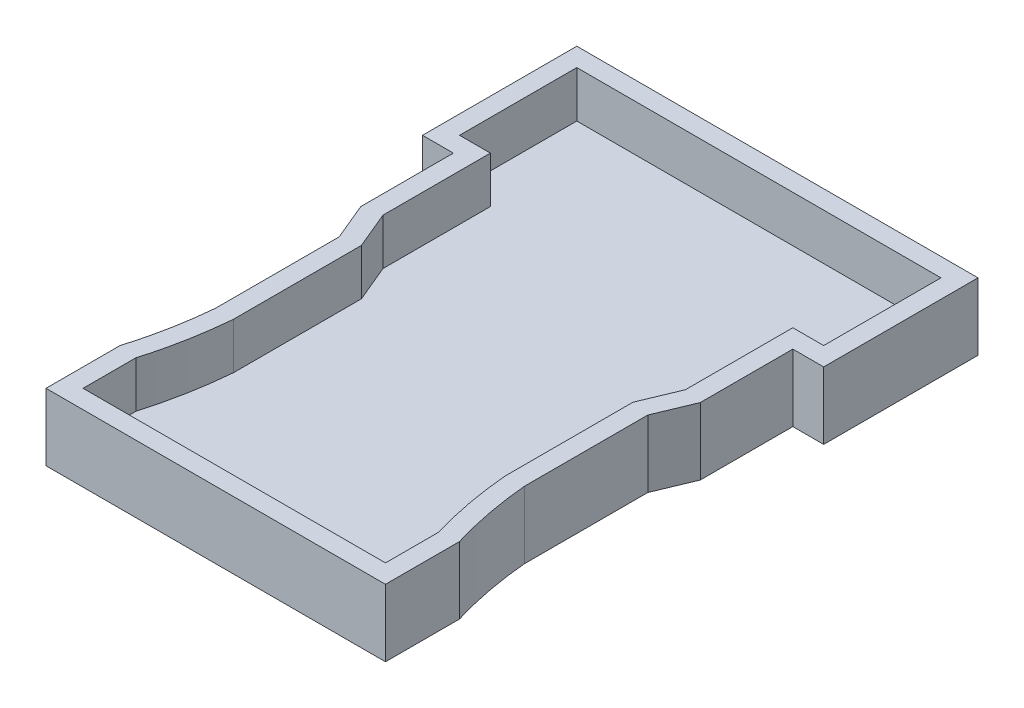
ISO-10303-21;
HEADER;
FILE_DESCRIPTION(('STEP AP214'),'2;1');
FILE_NAME('part.step','',(''),(''),'','','');
FILE_SCHEMA(('AUTOMOTIVE_DESIGN { 1 0 10303 214 1 1 1 1 }'));
ENDSEC;
DATA;
#1=APPLICATION_CONTEXT('core data for automotive mechanical design processes');
#2=APPLICATION_PROTOCOL_DEFINITION('international standard','automotive_design',2000,#1);
#3=PRODUCT_CONTEXT('',#1,'mechanical');
#4=PRODUCT('Part','Part','',(#3));
#5=PRODUCT_RELATED_PRODUCT_CATEGORY('part','',(#4));
#6=PRODUCT_DEFINITION_FORMATION('','',#4);
#7=PRODUCT_DEFINITION_CONTEXT('part definition',#1,'design');
#8=PRODUCT_DEFINITION('design','',#6,#7);
#9=PRODUCT_DEFINITION_SHAPE('','',#8);
#10=(LENGTH_UNIT() NAMED_UNIT(*) SI_UNIT(.MILLI.,.METRE.));
#11=(NAMED_UNIT(*) PLANE_ANGLE_UNIT() SI_UNIT($,.RADIAN.));
#12=(NAMED_UNIT(*) SI_UNIT($,.STERADIAN.) SOLID_ANGLE_UNIT());
#13=UNCERTAINTY_MEASURE_WITH_UNIT(LENGTH_MEASURE(1.E-05),#10,'distance_accuracy_value','');
#14=(GEOMETRIC_REPRESENTATION_CONTEXT(3) GLOBAL_UNCERTAINTY_ASSIGNED_CONTEXT((#13)) GLOBAL_UNIT_ASSIGNED_CONTEXT((#10,
#11,#12)) REPRESENTATION_CONTEXT('',''));
#15=CARTESIAN_POINT('',(0.,0.,0.));
#16=DIRECTION('',(0.,0.,1.));
#17=DIRECTION('',(1.,0.,0.));
#18=AXIS2_PLACEMENT_3D('',#15,#16,#17);
#19=CARTESIAN_POINT('',(97.3667090000003,18.415,69.4265820000001));
#20=CARTESIAN_POINT('',(98.3762706750737,18.415,80.7665378763553));
#21=CARTESIAN_POINT('',(101.599995682,18.415,91.4400000000001));
#22=B_SPLINE_CURVE_WITH_KNOTS('',2,(#19,#20,#21),.UNSPECIFIED.,.F.,.F.,(3,3),(0.,
0.50454040651961),.UNSPECIFIED.);
#23=DIRECTION('',(0.,-1.,0.));
#24=VECTOR('',#23,1.);
#25=SURFACE_OF_LINEAR_EXTRUSION('',#22,#24);
#26=CARTESIAN_POINT('',(97.3667090000003,0.,69.4265820000001));
#27=CARTESIAN_POINT('',(98.3762706750737,0.,80.7665378763553));
#28=CARTESIAN_POINT('',(101.599995682,0.,91.4400000000001));
#29=B_SPLINE_CURVE_WITH_KNOTS('',2,(#26,#27,#28),.UNSPECIFIED.,.F.,.F.,(3,3),(0.,
0.50454040651961),.UNSPECIFIED.);
#30=CARTESIAN_POINT('',(97.3667090000003,0.,69.4265820000001));
#31=VERTEX_POINT('',#30);
#32=CARTESIAN_POINT('',(101.599995682,0.,91.4400000000001));
#33=VERTEX_POINT('',#32);
#34=EDGE_CURVE('E211',#31,#33,#29,.T.);
#35=ORIENTED_EDGE('',*,*,#34,.F.);
#36=DIRECTION('',(0.,-1.,0.));
#37=VECTOR('',#36,1.);
#38=CARTESIAN_POINT('',(97.3667090000003,18.415,69.4265820000001));
#39=LINE('',#38,#37);
#40=CARTESIAN_POINT('',(97.3667090000003,18.415,69.4265820000001));
#41=VERTEX_POINT('',#40);
#42=EDGE_CURVE('E11',#41,#31,#39,.T.);
#43=ORIENTED_EDGE('',*,*,#42,.F.);
#44=CARTESIAN_POINT('',(101.599995682,18.415,91.4400000000001));
#45=VERTEX_POINT('',#44);
#46=EDGE_CURVE('E279',#41,#45,#22,.T.);
#47=ORIENTED_EDGE('',*,*,#46,.T.);
#48=DIRECTION('',(0.,-1.,0.));
#49=VECTOR('',#48,1.);
#50=CARTESIAN_POINT('',(101.599995682,18.415,91.4400000000001));
#51=LINE('',#50,#49);
#52=EDGE_CURVE('E76',#45,#33,#51,.T.);
#53=ORIENTED_EDGE('',*,*,#52,.T.);
#54=EDGE_LOOP('',(#35,#43,#47,#53));
#55=FACE_BOUND('',#54,.T.);
#56=ADVANCED_FACE('F47',(#55),#25,.T.);
#57=CARTESIAN_POINT('',(97.3667090000003,18.415,0.));
#58=DIRECTION('',(1.,0.,0.));
#59=DIRECTION('',(0.,0.,-1.));
#60=AXIS2_PLACEMENT_3D('',#57,#58,#59);
#61=PLANE('',#60);
#62=DIRECTION('',(0.,0.,1.));
#63=VECTOR('',#62,1.);
#64=CARTESIAN_POINT('',(97.3667090000003,0.,0.));
#65=LINE('',#64,#63);
#66=CARTESIAN_POINT('',(97.3667090000003,0.,35.5600000000001));
#67=VERTEX_POINT('',#66);
#68=EDGE_CURVE('E216',#67,#31,#65,.T.);
#69=ORIENTED_EDGE('',*,*,#68,.F.);
#70=DIRECTION('',(0.,-1.,0.));
#71=VECTOR('',#70,1.);
#72=CARTESIAN_POINT('',(97.3667090000003,18.415,35.5600000000001));
#73=LINE('',#72,#71);
#74=CARTESIAN_POINT('',(97.3667090000003,18.415,35.5600000000001));
#75=VERTEX_POINT('',#74);
#76=EDGE_CURVE('E59',#75,#67,#73,.T.);
#77=ORIENTED_EDGE('',*,*,#76,.F.);
#78=DIRECTION('',(0.,0.,1.));
#79=VECTOR('',#78,1.);
#80=CARTESIAN_POINT('',(97.3667090000003,18.415,0.));
#81=LINE('',#80,#79);
#82=EDGE_CURVE('E404',#75,#41,#81,.T.);
#83=ORIENTED_EDGE('',*,*,#82,.T.);
#84=ORIENTED_EDGE('',*,*,#42,.T.);
#85=EDGE_LOOP('',(#69,#77,#83,#84));
#86=FACE_BOUND('',#85,.T.);
#87=ADVANCED_FACE('F829',(#86),#61,.T.);
#88=CARTESIAN_POINT('',(95.5888279635049,18.415,39.8270851709958));
#89=DIRECTION('',(0.923082385009784,0.,0.38460227571434));
#90=DIRECTION('',(0.38460227571434,0.,-0.923082385009784));
#91=AXIS2_PLACEMENT_3D('',#88,#89,#90);
#92=PLANE('',#91);
#93=DIRECTION('',(-0.38460227571434,0.,0.923082385009784));
#94=VECTOR('',#93,1.);
#95=CARTESIAN_POINT('',(95.5888279635049,0.,39.8270851709958));
#96=LINE('',#95,#94);
#97=CARTESIAN_POINT('',(101.599873,0.,25.4000000000001));
#98=VERTEX_POINT('',#97);
#99=EDGE_CURVE('E224',#98,#67,#96,.T.);
#100=ORIENTED_EDGE('',*,*,#99,.F.);
#101=DIRECTION('',(0.,-1.,0.));
#102=VECTOR('',#101,1.);
#103=CARTESIAN_POINT('',(101.599873,18.415,25.4000000000001));
#104=LINE('',#103,#102);
#105=CARTESIAN_POINT('',(101.599873,18.415,25.4000000000001));
#106=VERTEX_POINT('',#105);
#107=EDGE_CURVE('E315',#106,#98,#104,.T.);
#108=ORIENTED_EDGE('',*,*,#107,.F.);
#109=DIRECTION('',(-0.38460227571434,0.,0.923082385009784));
#110=VECTOR('',#109,1.);
#111=CARTESIAN_POINT('',(95.5888279635049,18.415,39.8270851709958));
#112=LINE('',#111,#110);
#113=EDGE_CURVE('E400',#106,#75,#112,.T.);
#114=ORIENTED_EDGE('',*,*,#113,.T.);
#115=ORIENTED_EDGE('',*,*,#76,.T.);
#116=EDGE_LOOP('',(#100,#108,#114,#115));
#117=FACE_BOUND('',#116,.T.);
#118=ADVANCED_FACE('F833',(#117),#92,.T.);
#119=CARTESIAN_POINT('',(101.599873,18.415,0.));
#120=DIRECTION('',(1.,0.,0.));
#121=DIRECTION('',(0.,0.,-1.));
#122=AXIS2_PLACEMENT_3D('',#119,#120,#121);
#123=PLANE('',#122);
#124=DIRECTION('',(0.,0.,1.));
#125=VECTOR('',#124,1.);
#126=CARTESIAN_POINT('',(101.599873,0.,0.));
#127=LINE('',#126,#125);
#128=CARTESIAN_POINT('',(101.599873,0.,1.22987282083515E-13));
#129=VERTEX_POINT('',#128);
#130=EDGE_CURVE('E228',#129,#98,#127,.T.);
#131=ORIENTED_EDGE('',*,*,#130,.F.);
#132=DIRECTION('',(0.,-1.,0.));
#133=VECTOR('',#132,1.);
#134=CARTESIAN_POINT('',(101.599873,18.415,1.22987282083515E-13));
#135=LINE('',#134,#133);
#136=CARTESIAN_POINT('',(101.599873,18.415,1.22987282083515E-13));
#137=VERTEX_POINT('',#136);
#138=EDGE_CURVE('E312',#137,#129,#135,.T.);
#139=ORIENTED_EDGE('',*,*,#138,.F.);
#140=DIRECTION('',(0.,0.,1.));
#141=VECTOR('',#140,1.);
#142=CARTESIAN_POINT('',(101.599873,18.415,0.));
#143=LINE('',#142,#141);
#144=EDGE_CURVE('E396',#137,#106,#143,.T.);
#145=ORIENTED_EDGE('',*,*,#144,.T.);
#146=ORIENTED_EDGE('',*,*,#107,.T.);
#147=EDGE_LOOP('',(#131,#139,#145,#146));
#148=FACE_BOUND('',#147,.T.);
#149=ADVANCED_FACE('F843',(#148),#123,.T.);
#150=CARTESIAN_POINT('',(0.,18.415,1.35006249142304E-13));
#151=DIRECTION('',(0.,0.,1.));
#152=DIRECTION('',(1.,0.,0.));
#153=AXIS2_PLACEMENT_3D('',#150,#151,#152);
#154=PLANE('',#153);
#155=DIRECTION('',(-1.,0.,0.));
#156=VECTOR('',#155,1.);
#157=CARTESIAN_POINT('',(0.,0.,1.35006249142304E-13));
#158=LINE('',#157,#156);
#159=CARTESIAN_POINT('',(110.066582,0.,1.21985695235396E-13));
#160=VERTEX_POINT('',#159);
#161=EDGE_CURVE('E232',#160,#129,#158,.T.);
#162=ORIENTED_EDGE('',*,*,#161,.F.);
#163=DIRECTION('',(0.,-1.,0.));
#164=VECTOR('',#163,1.);
#165=CARTESIAN_POINT('',(110.066582,18.415,1.21985695235396E-13));
#166=LINE('',#165,#164);
#167=CARTESIAN_POINT('',(110.066582,18.415,1.21985695235396E-13));
#168=VERTEX_POINT('',#167);
#169=EDGE_CURVE('E309',#168,#160,#166,.T.);
#170=ORIENTED_EDGE('',*,*,#169,.F.);
#171=DIRECTION('',(-1.,0.,0.));
#172=VECTOR('',#171,1.);
#173=CARTESIAN_POINT('',(0.,18.415,1.35006249142304E-13));
#174=LINE('',#173,#172);
#175=EDGE_CURVE('E392',#168,#137,#174,.T.);
#176=ORIENTED_EDGE('',*,*,#175,.T.);
#177=ORIENTED_EDGE('',*,*,#138,.T.);
#178=EDGE_LOOP('',(#162,#170,#176,#177));
#179=FACE_BOUND('',#178,.T.);
#180=ADVANCED_FACE('F847',(#179),#154,.T.);
#181=CARTESIAN_POINT('',(110.066582,18.415,0.));
#182=DIRECTION('',(-1.,0.,0.));
#183=DIRECTION('',(0.,0.,1.));
#184=AXIS2_PLACEMENT_3D('',#181,#182,#183);
#185=PLANE('',#184);
#186=DIRECTION('',(0.,0.,-1.));
#187=VECTOR('',#186,1.);
#188=CARTESIAN_POINT('',(110.066582,0.,0.));
#189=LINE('',#188,#187);
#190=CARTESIAN_POINT('',(110.066582,0.,-42.333418));
#191=VERTEX_POINT('',#190);
#192=EDGE_CURVE('E236',#160,#191,#189,.T.);
#193=ORIENTED_EDGE('',*,*,#192,.T.);
#194=DIRECTION('',(0.,-1.,0.));
#195=VECTOR('',#194,1.);
#196=CARTESIAN_POINT('',(110.066582,18.415,-42.333418));
#197=LINE('',#196,#195);
#198=CARTESIAN_POINT('',(110.066582,18.415,-42.333418));
#199=VERTEX_POINT('',#198);
#200=EDGE_CURVE('E306',#199,#191,#197,.T.);
#201=ORIENTED_EDGE('',*,*,#200,.F.);
#202=DIRECTION('',(0.,0.,-1.));
#203=VECTOR('',#202,1.);
#204=CARTESIAN_POINT('',(110.066582,18.415,0.));
#205=LINE('',#204,#203);
#206=EDGE_CURVE('E389',#168,#199,#205,.T.);
#207=ORIENTED_EDGE('',*,*,#206,.F.);
#208=ORIENTED_EDGE('',*,*,#169,.T.);
#209=EDGE_LOOP('',(#193,#201,#207,#208));
#210=FACE_BOUND('',#209,.T.);
#211=ADVANCED_FACE('F852',(#210),#185,.F.);
#212=CARTESIAN_POINT('',(0.,18.415,-42.333418));
#213=DIRECTION('',(0.,0.,-1.));
#214=DIRECTION('',(-1.,0.,0.));
#215=AXIS2_PLACEMENT_3D('',#212,#213,#214);
#216=PLANE('',#215);
#217=DIRECTION('',(1.,0.,0.));
#218=VECTOR('',#217,1.);
#219=CARTESIAN_POINT('',(0.,0.,-42.333418));
#220=LINE('',#219,#218);
#221=CARTESIAN_POINT('',(0.,0.,-42.333418));
#222=VERTEX_POINT('',#221);
#223=EDGE_CURVE('E240',#222,#191,#220,.T.);
#224=ORIENTED_EDGE('',*,*,#223,.F.);
#225=DIRECTION('',(0.,-1.,0.));
#226=VECTOR('',#225,1.);
#227=CARTESIAN_POINT('',(0.,18.415,-42.333418));
#228=LINE('',#227,#226);
#229=CARTESIAN_POINT('',(0.,18.415,-42.333418));
#230=VERTEX_POINT('',#229);
#231=EDGE_CURVE('E303',#230,#222,#228,.T.);
#232=ORIENTED_EDGE('',*,*,#231,.F.);
#233=DIRECTION('',(1.,0.,0.));
#234=VECTOR('',#233,1.);
#235=CARTESIAN_POINT('',(0.,18.415,-42.333418));
#236=LINE('',#235,#234);
#237=EDGE_CURVE('E385',#230,#199,#236,.T.);
#238=ORIENTED_EDGE('',*,*,#237,.T.);
#239=ORIENTED_EDGE('',*,*,#200,.T.);
#240=EDGE_LOOP('',(#224,#232,#238,#239));
#241=FACE_BOUND('',#240,.T.);
#242=ADVANCED_FACE('F879',(#241),#216,.T.);
#243=CARTESIAN_POINT('',(0.,18.415,0.));
#244=DIRECTION('',(-1.,0.,0.));
#245=DIRECTION('',(0.,0.,1.));
#246=AXIS2_PLACEMENT_3D('',#243,#244,#245);
#247=PLANE('',#246);
#248=DIRECTION('',(0.,0.,-1.));
#249=VECTOR('',#248,1.);
#250=CARTESIAN_POINT('',(0.,0.,0.));
#251=LINE('',#250,#249);
#252=CARTESIAN_POINT('',(0.,0.,0.));
#253=VERTEX_POINT('',#252);
#254=EDGE_CURVE('E244',#253,#222,#251,.T.);
#255=ORIENTED_EDGE('',*,*,#254,.F.);
#256=DIRECTION('',(0.,-1.,0.));
#257=VECTOR('',#256,1.);
#258=CARTESIAN_POINT('',(0.,18.415,0.));
#259=LINE('',#258,#257);
#260=CARTESIAN_POINT('',(0.,18.415,0.));
#261=VERTEX_POINT('',#260);
#262=EDGE_CURVE('E300',#261,#253,#259,.T.);
#263=ORIENTED_EDGE('',*,*,#262,.F.);
#264=DIRECTION('',(0.,0.,-1.));
#265=VECTOR('',#264,1.);
#266=CARTESIAN_POINT('',(0.,18.415,0.));
#267=LINE('',#266,#265);
#268=EDGE_CURVE('E381',#261,#230,#267,.T.);
#269=ORIENTED_EDGE('',*,*,#268,.T.);
#270=ORIENTED_EDGE('',*,*,#231,.T.);
#271=EDGE_LOOP('',(#255,#263,#269,#270));
#272=FACE_BOUND('',#271,.T.);
#273=ADVANCED_FACE('F858',(#272),#247,.T.);
#274=CARTESIAN_POINT('',(0.,18.415,0.));
#275=DIRECTION('',(0.,0.,-1.));
#276=DIRECTION('',(-1.,0.,0.));
#277=AXIS2_PLACEMENT_3D('',#274,#275,#276);
#278=PLANE('',#277);
#279=DIRECTION('',(1.,0.,0.));
#280=VECTOR('',#279,1.);
#281=CARTESIAN_POINT('',(0.,0.,0.));
#282=LINE('',#281,#280);
#283=CARTESIAN_POINT('',(8.4666328,0.,0.));
#284=VERTEX_POINT('',#283);
#285=EDGE_CURVE('E248',#253,#284,#282,.T.);
#286=ORIENTED_EDGE('',*,*,#285,.T.);
#287=DIRECTION('',(0.,-1.,0.));
#288=VECTOR('',#287,1.);
#289=CARTESIAN_POINT('',(8.4666328,18.415,0.));
#290=LINE('',#289,#288);
#291=CARTESIAN_POINT('',(8.4666328,18.415,0.));
#292=VERTEX_POINT('',#291);
#293=EDGE_CURVE('E297',#292,#284,#290,.T.);
#294=ORIENTED_EDGE('',*,*,#293,.F.);
#295=DIRECTION('',(1.,0.,0.));
#296=VECTOR('',#295,1.);
#297=CARTESIAN_POINT('',(0.,18.415,0.));
#298=LINE('',#297,#296);
#299=EDGE_CURVE('E378',#261,#292,#298,.T.);
#300=ORIENTED_EDGE('',*,*,#299,.F.);
#301=ORIENTED_EDGE('',*,*,#262,.T.);
#302=EDGE_LOOP('',(#286,#294,#300,#301));
#303=FACE_BOUND('',#302,.T.);
#304=ADVANCED_FACE('F864',(#303),#278,.F.);
#305=CARTESIAN_POINT('',(8.4666328,18.415,0.));
#306=DIRECTION('',(-1.,0.,0.));
#307=DIRECTION('',(0.,0.,1.));
#308=AXIS2_PLACEMENT_3D('',#305,#306,#307);
#309=PLANE('',#308);
#310=DIRECTION('',(0.,0.,-1.));
#311=VECTOR('',#310,1.);
#312=CARTESIAN_POINT('',(8.4666328,0.,0.));
#313=LINE('',#312,#311);
#314=CARTESIAN_POINT('',(8.4666328,0.,25.4000000000001));
#315=VERTEX_POINT('',#314);
#316=EDGE_CURVE('E252',#315,#284,#313,.T.);
#317=ORIENTED_EDGE('',*,*,#316,.F.);
#318=DIRECTION('',(0.,-1.,0.));
#319=VECTOR('',#318,1.);
#320=CARTESIAN_POINT('',(8.4666328,18.415,25.4000000000001));
#321=LINE('',#320,#319);
#322=CARTESIAN_POINT('',(8.4666328,18.415,25.4000000000001));
#323=VERTEX_POINT('',#322);
#324=EDGE_CURVE('E294',#323,#315,#321,.T.);
#325=ORIENTED_EDGE('',*,*,#324,.F.);
#326=DIRECTION('',(0.,0.,-1.));
#327=VECTOR('',#326,1.);
#328=CARTESIAN_POINT('',(8.4666328,18.415,0.));
#329=LINE('',#328,#327);
#330=EDGE_CURVE('E374',#323,#292,#329,.T.);
#331=ORIENTED_EDGE('',*,*,#330,.T.);
#332=ORIENTED_EDGE('',*,*,#293,.T.);
#333=EDGE_LOOP('',(#317,#325,#331,#332));
#334=FACE_BOUND('',#333,.T.);
#335=ADVANCED_FACE('F870',(#334),#309,.T.);
#336=CARTESIAN_POINT('',(-1.80354521602617,18.415,0.751474167435595));
#337=DIRECTION('',(0.923077469275669,0.,-0.384614073735772));
#338=DIRECTION('',(-0.384614073735772,0.,-0.923077469275669));
#339=AXIS2_PLACEMENT_3D('',#336,#337,#338);
#340=PLANE('',#339);
#341=DIRECTION('',(0.384614073735772,0.,0.923077469275669));
#342=VECTOR('',#341,1.);
#343=CARTESIAN_POINT('',(-1.80354521602617,0.,0.751474167435595));
#344=LINE('',#343,#342);
#345=CARTESIAN_POINT('',(12.6999492000003,0.,35.5600000000001));
#346=VERTEX_POINT('',#345);
#347=EDGE_CURVE('E256',#315,#346,#344,.T.);
#348=ORIENTED_EDGE('',*,*,#347,.T.);
#349=DIRECTION('',(0.,-1.,0.));
#350=VECTOR('',#349,1.);
#351=CARTESIAN_POINT('',(12.6999492000003,18.415,35.5600000000001));
#352=LINE('',#351,#350);
#353=CARTESIAN_POINT('',(12.6999492000003,18.415,35.5600000000001));
#354=VERTEX_POINT('',#353);
#355=EDGE_CURVE('E290',#354,#346,#352,.T.);
#356=ORIENTED_EDGE('',*,*,#355,.F.);
#357=DIRECTION('',(0.384614073735772,0.,0.923077469275669));
#358=VECTOR('',#357,1.);
#359=CARTESIAN_POINT('',(-1.80354521602617,18.415,0.751474167435595));
#360=LINE('',#359,#358);
#361=EDGE_CURVE('E371',#323,#354,#360,.T.);
#362=ORIENTED_EDGE('',*,*,#361,.F.);
#363=ORIENTED_EDGE('',*,*,#324,.T.);
#364=EDGE_LOOP('',(#348,#356,#362,#363));
#365=FACE_BOUND('',#364,.T.);
#366=ADVANCED_FACE('F873',(#365),#340,.F.);
#367=CARTESIAN_POINT('',(12.6999492000003,18.415,0.));
#368=DIRECTION('',(1.,0.,0.));
#369=DIRECTION('',(0.,0.,-1.));
#370=AXIS2_PLACEMENT_3D('',#367,#368,#369);
#371=PLANE('',#370);
#372=DIRECTION('',(0.,0.,1.));
#373=VECTOR('',#372,1.);
#374=CARTESIAN_POINT('',(12.6999492000003,0.,0.));
#375=LINE('',#374,#373);
#376=CARTESIAN_POINT('',(12.6999492000003,0.,69.4265820000001));
#377=VERTEX_POINT('',#376);
#378=EDGE_CURVE('E259',#346,#377,#375,.T.);
#379=ORIENTED_EDGE('',*,*,#378,.T.);
#380=DIRECTION('',(0.,-1.,0.));
#381=VECTOR('',#380,1.);
#382=CARTESIAN_POINT('',(12.6999492000003,18.415,69.4265820000001));
#383=LINE('',#382,#381);
#384=CARTESIAN_POINT('',(12.6999492000003,18.415,69.4265820000001));
#385=VERTEX_POINT('',#384);
#386=EDGE_CURVE('E286',#385,#377,#383,.T.);
#387=ORIENTED_EDGE('',*,*,#386,.F.);
#388=DIRECTION('',(0.,0.,1.));
#389=VECTOR('',#388,1.);
#390=CARTESIAN_POINT('',(12.6999492000003,18.415,0.));
#391=LINE('',#390,#389);
#392=EDGE_CURVE('E365',#354,#385,#391,.T.);
#393=ORIENTED_EDGE('',*,*,#392,.F.);
#394=ORIENTED_EDGE('',*,*,#355,.T.);
#395=EDGE_LOOP('',(#379,#387,#393,#394));
#396=FACE_BOUND('',#395,.T.);
#397=ADVANCED_FACE('F357',(#396),#371,.F.);
#398=CARTESIAN_POINT('',(12.6999492000003,18.415,69.4265820000001));
#399=CARTESIAN_POINT('',(11.6904041894543,18.415,80.766544706064));
#400=CARTESIAN_POINT('',(8.46666328000029,18.415,91.4400000000001));
#401=B_SPLINE_CURVE_WITH_KNOTS('',2,(#398,#399,#400),.UNSPECIFIED.,.F.,.F.,(3,3),(0.,
0.504540068775169),.UNSPECIFIED.);
#402=DIRECTION('',(0.,-1.,0.));
#403=VECTOR('',#402,1.);
#404=SURFACE_OF_LINEAR_EXTRUSION('',#401,#403);
#405=CARTESIAN_POINT('',(12.6999492000003,0.,69.4265820000001));
#406=CARTESIAN_POINT('',(11.6904041894543,0.,80.766544706064));
#407=CARTESIAN_POINT('',(8.46666328000029,0.,91.4400000000001));
#408=B_SPLINE_CURVE_WITH_KNOTS('',2,(#405,#406,#407),.UNSPECIFIED.,.F.,.F.,(3,3),(0.,
0.504540068775169),.UNSPECIFIED.);
#409=CARTESIAN_POINT('',(8.46666328000029,0.,91.4400000000001));
#410=VERTEX_POINT('',#409);
#411=EDGE_CURVE('E262',#377,#410,#408,.T.);
#412=ORIENTED_EDGE('',*,*,#411,.T.);
#413=DIRECTION('',(0.,-1.,0.));
#414=VECTOR('',#413,1.);
#415=CARTESIAN_POINT('',(8.46666328000029,18.415,91.4400000000001));
#416=LINE('',#415,#414);
#417=CARTESIAN_POINT('',(8.46666328000029,18.415,91.4400000000001));
#418=VERTEX_POINT('',#417);
#419=EDGE_CURVE('E200',#418,#410,#416,.T.);
#420=ORIENTED_EDGE('',*,*,#419,.F.);
#421=EDGE_CURVE('E185',#385,#418,#401,.T.);
#422=ORIENTED_EDGE('',*,*,#421,.F.);
#423=ORIENTED_EDGE('',*,*,#386,.T.);
#424=EDGE_LOOP('',(#412,#420,#422,#423));
#425=FACE_BOUND('',#424,.T.);
#426=ADVANCED_FACE('F354',(#425),#404,.F.);
#427=CARTESIAN_POINT('',(8.46666328000028,18.415,0.));
#428=DIRECTION('',(1.,0.,0.));
#429=DIRECTION('',(0.,0.,-1.));
#430=AXIS2_PLACEMENT_3D('',#427,#428,#429);
#431=PLANE('',#430);
#432=DIRECTION('',(0.,0.,1.));
#433=VECTOR('',#432,1.);
#434=CARTESIAN_POINT('',(8.46666328000028,0.,0.));
#435=LINE('',#434,#433);
#436=CARTESIAN_POINT('',(8.46666328000029,0.,111.76));
#437=VERTEX_POINT('',#436);
#438=EDGE_CURVE('E195',#410,#437,#435,.T.);
#439=ORIENTED_EDGE('',*,*,#438,.T.);
#440=DIRECTION('',(0.,-1.,0.));
#441=VECTOR('',#440,1.);
#442=CARTESIAN_POINT('',(8.46666328000029,18.415,111.76));
#443=LINE('',#442,#441);
#444=CARTESIAN_POINT('',(8.46666328000029,18.415,111.76));
#445=VERTEX_POINT('',#444);
#446=EDGE_CURVE('E192',#445,#437,#443,.T.);
#447=ORIENTED_EDGE('',*,*,#446,.F.);
#448=DIRECTION('',(0.,0.,1.));
#449=VECTOR('',#448,1.);
#450=CARTESIAN_POINT('',(8.46666328000028,18.415,0.));
#451=LINE('',#450,#449);
#452=EDGE_CURVE('E178',#418,#445,#451,.T.);
#453=ORIENTED_EDGE('',*,*,#452,.F.);
#454=ORIENTED_EDGE('',*,*,#419,.T.);
#455=EDGE_LOOP('',(#439,#447,#453,#454));
#456=FACE_BOUND('',#455,.T.);
#457=ADVANCED_FACE('F193',(#456),#431,.F.);
#458=CARTESIAN_POINT('',(0.,18.415,111.76));
#459=DIRECTION('',(0.,0.,1.));
#460=DIRECTION('',(1.,0.,0.));
#461=AXIS2_PLACEMENT_3D('',#458,#459,#460);
#462=PLANE('',#461);
#463=DIRECTION('',(-1.,0.,0.));
#464=VECTOR('',#463,1.);
#465=CARTESIAN_POINT('',(0.,0.,111.76));
#466=LINE('',#465,#464);
#467=CARTESIAN_POINT('',(101.599995682,0.,111.76));
#468=VERTEX_POINT('',#467);
#469=EDGE_CURVE('E272',#468,#437,#466,.T.);
#470=ORIENTED_EDGE('',*,*,#469,.F.);
#471=DIRECTION('',(0.,-1.,0.));
#472=VECTOR('',#471,1.);
#473=CARTESIAN_POINT('',(101.599995682,18.415,111.76));
#474=LINE('',#473,#472);
#475=CARTESIAN_POINT('',(101.599995682,18.415,111.76));
#476=VERTEX_POINT('',#475);
#477=EDGE_CURVE('E201',#476,#468,#474,.T.);
#478=ORIENTED_EDGE('',*,*,#477,.F.);
#479=DIRECTION('',(-1.,0.,0.));
#480=VECTOR('',#479,1.);
#481=CARTESIAN_POINT('',(0.,18.415,111.76));
#482=LINE('',#481,#480);
#483=EDGE_CURVE('E183',#476,#445,#482,.T.);
#484=ORIENTED_EDGE('',*,*,#483,.T.);
#485=ORIENTED_EDGE('',*,*,#446,.T.);
#486=EDGE_LOOP('',(#470,#478,#484,#485));
#487=FACE_BOUND('',#486,.T.);
#488=ADVANCED_FACE('F203',(#487),#462,.T.);
#489=CARTESIAN_POINT('',(101.599995682,18.415,0.));
#490=DIRECTION('',(1.,0.,0.));
#491=DIRECTION('',(0.,0.,-1.));
#492=AXIS2_PLACEMENT_3D('',#489,#490,#491);
#493=PLANE('',#492);
#494=DIRECTION('',(0.,0.,1.));
#495=VECTOR('',#494,1.);
#496=CARTESIAN_POINT('',(101.599995682,0.,0.));
#497=LINE('',#496,#495);
#498=EDGE_CURVE('E275',#33,#468,#497,.T.);
#499=ORIENTED_EDGE('',*,*,#498,.F.);
#500=ORIENTED_EDGE('',*,*,#52,.F.);
#501=DIRECTION('',(0.,0.,1.));
#502=VECTOR('',#501,1.);
#503=CARTESIAN_POINT('',(101.599995682,18.415,0.));
#504=LINE('',#503,#502);
#505=EDGE_CURVE('E205',#45,#476,#504,.T.);
#506=ORIENTED_EDGE('',*,*,#505,.T.);
#507=ORIENTED_EDGE('',*,*,#477,.T.);
#508=EDGE_LOOP('',(#499,#500,#506,#507));
#509=FACE_BOUND('',#508,.T.);
#510=ADVANCED_FACE('F341',(#509),#493,.T.);
#511=CARTESIAN_POINT('',(0.,18.415,0.));
#512=DIRECTION('',(0.,1.,0.));
#513=DIRECTION('',(0.,0.,1.));
#514=AXIS2_PLACEMENT_3D('',#511,#512,#513);
#515=PLANE('',#514);
#516=DIRECTION('',(0.,0.,-1.));
#517=VECTOR('',#516,1.);
#518=CARTESIAN_POINT('',(104.986582,18.415,-5.07999999999988));
#519=LINE('',#518,#517);
#520=CARTESIAN_POINT('',(104.986582,18.415,-5.07999999999988));
#521=VERTEX_POINT('',#520);
#522=CARTESIAN_POINT('',(104.986582,18.415,-37.253418));
#523=VERTEX_POINT('',#522);
#524=EDGE_CURVE('E67',#521,#523,#519,.T.);
#525=ORIENTED_EDGE('',*,*,#524,.F.);
#526=DIRECTION('',(-1.,0.,0.));
#527=VECTOR('',#526,1.);
#528=CARTESIAN_POINT('',(104.986582,18.415,-5.07999999999988));
#529=LINE('',#528,#527);
#530=CARTESIAN_POINT('',(96.5198730000004,18.415,-5.07999999999988));
#531=VERTEX_POINT('',#530);
#532=EDGE_CURVE('E648',#521,#531,#529,.T.);
#533=ORIENTED_EDGE('',*,*,#532,.T.);
#534=DIRECTION('',(0.,0.,1.));
#535=VECTOR('',#534,1.);
#536=CARTESIAN_POINT('',(96.5198730000004,18.415,-5.07999999999988));
#537=LINE('',#536,#535);
#538=CARTESIAN_POINT('',(96.5198730000004,18.415,24.384037514015));
#539=VERTEX_POINT('',#538);
#540=EDGE_CURVE('E644',#531,#539,#537,.T.);
#541=ORIENTED_EDGE('',*,*,#540,.T.);
#542=DIRECTION('',(-0.38460227571434,0.,0.923082385009784));
#543=VECTOR('',#542,1.);
#544=CARTESIAN_POINT('',(96.5198730000004,18.415,24.384037514015));
#545=LINE('',#544,#543);
#546=CARTESIAN_POINT('',(92.2867090000003,18.415,34.5440375140149));
#547=VERTEX_POINT('',#546);
#548=EDGE_CURVE('E507',#539,#547,#545,.T.);
#549=ORIENTED_EDGE('',*,*,#548,.T.);
#550=DIRECTION('',(-5.53438970452129E-13,0.,1.));
#551=VECTOR('',#550,1.);
#552=CARTESIAN_POINT('',(92.2867090000003,18.415,34.5440375140149));
#553=LINE('',#552,#551);
#554=CARTESIAN_POINT('',(92.2867089999808,18.415,69.6498106312711));
#555=VERTEX_POINT('',#554);
#556=EDGE_CURVE('E498',#547,#555,#553,.T.);
#557=ORIENTED_EDGE('',*,*,#556,.T.);
#558=CARTESIAN_POINT('',(96.5199956819808,18.415,92.181575799748));
#559=CARTESIAN_POINT('',(94.3699508581627,18.415,84.8856837153887));
#560=CARTESIAN_POINT('',(92.959036165132,18.415,77.36838722479));
#561=CARTESIAN_POINT('',(92.2867089999967,18.415,69.6498106312798));
#562=B_SPLINE_CURVE_WITH_KNOTS('',3,(#558,#559,#560,#561),.UNSPECIFIED.,.F.,.F.,(4,4),(0.,1.),.UNSPECIFIED.);
#563=CARTESIAN_POINT('',(96.5199956819808,18.415,92.181575799748));
#564=VERTEX_POINT('',#563);
#565=EDGE_CURVE('E508',#555,#564,#562,.F.);
#566=ORIENTED_EDGE('',*,*,#565,.T.);
#567=DIRECTION('',(-7.11194278688606E-13,0.,1.));
#568=VECTOR('',#567,1.);
#569=CARTESIAN_POINT('',(96.5199956820106,18.415,92.1815757997671));
#570=LINE('',#569,#568);
#571=CARTESIAN_POINT('',(96.5199956820003,18.415,106.68));
#572=VERTEX_POINT('',#571);
#573=EDGE_CURVE('E511',#564,#572,#570,.T.);
#574=ORIENTED_EDGE('',*,*,#573,.T.);
#575=DIRECTION('',(-1.,0.,0.));
#576=VECTOR('',#575,1.);
#577=CARTESIAN_POINT('',(96.5199956820003,18.415,106.68));
#578=LINE('',#577,#576);
#579=CARTESIAN_POINT('',(13.5466632800003,18.415,106.68));
#580=VERTEX_POINT('',#579);
#581=EDGE_CURVE('E426',#572,#580,#578,.T.);
#582=ORIENTED_EDGE('',*,*,#581,.T.);
#583=DIRECTION('',(3.53204250310185E-13,0.,-1.));
#584=VECTOR('',#583,1.);
#585=CARTESIAN_POINT('',(13.5466632800003,18.415,106.68));
#586=LINE('',#585,#584);
#587=CARTESIAN_POINT('',(13.5466632800054,18.415,92.1815796197631));
#588=VERTEX_POINT('',#587);
#589=EDGE_CURVE('E423',#580,#588,#586,.T.);
#590=ORIENTED_EDGE('',*,*,#589,.T.);
#591=CARTESIAN_POINT('',(17.7799492000084,18.415,69.6498067943984));
#592=CARTESIAN_POINT('',(17.1076331661122,18.415,77.3683898631857));
#593=CARTESIAN_POINT('',(15.6967187581287,18.415,84.8856891977935));
#594=CARTESIAN_POINT('',(13.5466632800059,18.415,92.1815796197612));
#595=B_SPLINE_CURVE_WITH_KNOTS('',3,(#591,#592,#593,#594),.UNSPECIFIED.,.F.,.F.,(4,4),(0.,1.),.UNSPECIFIED.);
#596=CARTESIAN_POINT('',(17.7799492000084,18.415,69.6498067943984));
#597=VERTEX_POINT('',#596);
#598=EDGE_CURVE('E327',#588,#597,#595,.F.);
#599=ORIENTED_EDGE('',*,*,#598,.T.);
#600=DIRECTION('',(-1.15826771508622E-13,0.,-1.));
#601=VECTOR('',#600,1.);
#602=CARTESIAN_POINT('',(17.7799492000043,18.415,69.6498067943984));
#603=LINE('',#602,#601);
#604=CARTESIAN_POINT('',(17.7799492000003,18.415,34.5440037513864));
#605=VERTEX_POINT('',#604);
#606=EDGE_CURVE('E417',#597,#605,#603,.T.);
#607=ORIENTED_EDGE('',*,*,#606,.T.);
#608=DIRECTION('',(-0.384614073735772,0.,-0.923077469275669));
#609=VECTOR('',#608,1.);
#610=CARTESIAN_POINT('',(17.7799492000003,18.415,34.5440037513864));
#611=LINE('',#610,#609);
#612=CARTESIAN_POINT('',(13.5466328,18.415,24.3840037513864));
#613=VERTEX_POINT('',#612);
#614=EDGE_CURVE('E420',#605,#613,#611,.T.);
#615=ORIENTED_EDGE('',*,*,#614,.T.);
#616=DIRECTION('',(0.,0.,-1.));
#617=VECTOR('',#616,1.);
#618=CARTESIAN_POINT('',(13.5466328,18.415,24.3840037513864));
#619=LINE('',#618,#617);
#620=CARTESIAN_POINT('',(13.5466328,18.415,-5.08));
#621=VERTEX_POINT('',#620);
#622=EDGE_CURVE('E631',#613,#621,#619,.T.);
#623=ORIENTED_EDGE('',*,*,#622,.T.);
#624=DIRECTION('',(-1.,0.,0.));
#625=VECTOR('',#624,1.);
#626=CARTESIAN_POINT('',(13.5466328,18.415,-5.08));
#627=LINE('',#626,#625);
#628=CARTESIAN_POINT('',(5.08,18.415,-5.08));
#629=VERTEX_POINT('',#628);
#630=EDGE_CURVE('E627',#621,#629,#627,.T.);
#631=ORIENTED_EDGE('',*,*,#630,.T.);
#632=DIRECTION('',(0.,0.,-1.));
#633=VECTOR('',#632,1.);
#634=CARTESIAN_POINT('',(5.08,18.415,-5.08));
#635=LINE('',#634,#633);
#636=CARTESIAN_POINT('',(5.08,18.415,-37.253418));
#637=VERTEX_POINT('',#636);
#638=EDGE_CURVE('E623',#629,#637,#635,.T.);
#639=ORIENTED_EDGE('',*,*,#638,.T.);
#640=DIRECTION('',(1.,0.,0.));
#641=VECTOR('',#640,1.);
#642=CARTESIAN_POINT('',(5.08,18.415,-37.253418));
#643=LINE('',#642,#641);
#644=EDGE_CURVE('E619',#637,#523,#643,.T.);
#645=ORIENTED_EDGE('',*,*,#644,.T.);
#646=EDGE_LOOP('',(#525,#533,#541,#549,#557,#566,#574,#582,#590,#599,#607,#615,#623,#631,#639,#645));
#647=FACE_BOUND('',#646,.T.);
#648=ORIENTED_EDGE('',*,*,#46,.F.);
#649=ORIENTED_EDGE('',*,*,#82,.F.);
#650=ORIENTED_EDGE('',*,*,#113,.F.);
#651=ORIENTED_EDGE('',*,*,#144,.F.);
#652=ORIENTED_EDGE('',*,*,#175,.F.);
#653=ORIENTED_EDGE('',*,*,#206,.T.);
#654=ORIENTED_EDGE('',*,*,#237,.F.);
#655=ORIENTED_EDGE('',*,*,#268,.F.);
#656=ORIENTED_EDGE('',*,*,#299,.T.);
#657=ORIENTED_EDGE('',*,*,#330,.F.);
#658=ORIENTED_EDGE('',*,*,#361,.T.);
#659=ORIENTED_EDGE('',*,*,#392,.T.);
#660=ORIENTED_EDGE('',*,*,#421,.T.);
#661=ORIENTED_EDGE('',*,*,#452,.T.);
#662=ORIENTED_EDGE('',*,*,#483,.F.);
#663=ORIENTED_EDGE('',*,*,#505,.F.);
#664=EDGE_LOOP('',(#648,#649,#650,#651,#652,#653,#654,#655,#656,#657,#658,#659,#660,#661,#662,#663));
#665=FACE_BOUND('',#664,.T.);
#666=ADVANCED_FACE('F180',(#647,#665),#515,.T.);
#667=CARTESIAN_POINT('',(0.,0.,0.));
#668=DIRECTION('',(0.,1.,0.));
#669=DIRECTION('',(0.,0.,1.));
#670=AXIS2_PLACEMENT_3D('',#667,#668,#669);
#671=PLANE('',#670);
#672=ORIENTED_EDGE('',*,*,#34,.T.);
#673=ORIENTED_EDGE('',*,*,#498,.T.);
#674=ORIENTED_EDGE('',*,*,#469,.T.);
#675=ORIENTED_EDGE('',*,*,#438,.F.);
#676=ORIENTED_EDGE('',*,*,#411,.F.);
#677=ORIENTED_EDGE('',*,*,#378,.F.);
#678=ORIENTED_EDGE('',*,*,#347,.F.);
#679=ORIENTED_EDGE('',*,*,#316,.T.);
#680=ORIENTED_EDGE('',*,*,#285,.F.);
#681=ORIENTED_EDGE('',*,*,#254,.T.);
#682=ORIENTED_EDGE('',*,*,#223,.T.);
#683=ORIENTED_EDGE('',*,*,#192,.F.);
#684=ORIENTED_EDGE('',*,*,#161,.T.);
#685=ORIENTED_EDGE('',*,*,#130,.T.);
#686=ORIENTED_EDGE('',*,*,#99,.T.);
#687=ORIENTED_EDGE('',*,*,#68,.T.);
#688=EDGE_LOOP('',(#672,#673,#674,#675,#676,#677,#678,#679,#680,#681,#682,#683,#684,#685,#686,#687));
#689=FACE_BOUND('',#688,.T.);
#690=ADVANCED_FACE('F340',(#689),#671,.F.);
#691=CARTESIAN_POINT('',(104.986582,5.715,-5.07999999999988));
#692=DIRECTION('',(1.,0.,0.));
#693=DIRECTION('',(0.,0.,-1.));
#694=AXIS2_PLACEMENT_3D('',#691,#692,#693);
#695=PLANE('',#694);
#696=ORIENTED_EDGE('',*,*,#524,.T.);
#697=DIRECTION('',(0.,1.,0.));
#698=VECTOR('',#697,1.);
#699=CARTESIAN_POINT('',(104.986582,5.715,-37.253418));
#700=LINE('',#699,#698);
#701=CARTESIAN_POINT('',(104.986582,5.715,-37.253418));
#702=VERTEX_POINT('',#701);
#703=EDGE_CURVE('E614',#702,#523,#700,.T.);
#704=ORIENTED_EDGE('',*,*,#703,.F.);
#705=DIRECTION('',(0.,0.,-1.));
#706=VECTOR('',#705,1.);
#707=CARTESIAN_POINT('',(104.986582,5.715,-5.07999999999988));
#708=LINE('',#707,#706);
#709=CARTESIAN_POINT('',(104.986582,5.715,-5.07999999999988));
#710=VERTEX_POINT('',#709);
#711=EDGE_CURVE('E652',#710,#702,#708,.T.);
#712=ORIENTED_EDGE('',*,*,#711,.F.);
#713=DIRECTION('',(0.,1.,0.));
#714=VECTOR('',#713,1.);
#715=CARTESIAN_POINT('',(104.986582,5.715,-5.07999999999988));
#716=LINE('',#715,#714);
#717=EDGE_CURVE('E217',#710,#521,#716,.T.);
#718=ORIENTED_EDGE('',*,*,#717,.T.);
#719=EDGE_LOOP('',(#696,#704,#712,#718));
#720=FACE_BOUND('',#719,.T.);
#721=ADVANCED_FACE('F342',(#720),#695,.F.);
#722=CARTESIAN_POINT('',(104.986582,5.715,-5.07999999999988));
#723=DIRECTION('',(0.,0.,-1.));
#724=DIRECTION('',(-1.,0.,0.));
#725=AXIS2_PLACEMENT_3D('',#722,#723,#724);
#726=PLANE('',#725);
#727=ORIENTED_EDGE('',*,*,#532,.F.);
#728=ORIENTED_EDGE('',*,*,#717,.F.);
#729=DIRECTION('',(-1.,0.,0.));
#730=VECTOR('',#729,1.);
#731=CARTESIAN_POINT('',(104.986582,5.715,-5.07999999999988));
#732=LINE('',#731,#730);
#733=CARTESIAN_POINT('',(96.5198730000004,5.715,-5.07999999999988));
#734=VERTEX_POINT('',#733);
#735=EDGE_CURVE('E606',#710,#734,#732,.T.);
#736=ORIENTED_EDGE('',*,*,#735,.T.);
#737=DIRECTION('',(0.,1.,0.));
#738=VECTOR('',#737,1.);
#739=CARTESIAN_POINT('',(96.5198730000004,5.715,-5.07999999999988));
#740=LINE('',#739,#738);
#741=EDGE_CURVE('E655',#734,#531,#740,.T.);
#742=ORIENTED_EDGE('',*,*,#741,.T.);
#743=EDGE_LOOP('',(#727,#728,#736,#742));
#744=FACE_BOUND('',#743,.T.);
#745=ADVANCED_FACE('F539',(#744),#726,.T.);
#746=CARTESIAN_POINT('',(96.5198730000004,5.715,-5.07999999999988));
#747=DIRECTION('',(-1.,0.,0.));
#748=DIRECTION('',(0.,0.,1.));
#749=AXIS2_PLACEMENT_3D('',#746,#747,#748);
#750=PLANE('',#749);
#751=ORIENTED_EDGE('',*,*,#540,.F.);
#752=ORIENTED_EDGE('',*,*,#741,.F.);
#753=DIRECTION('',(0.,0.,1.));
#754=VECTOR('',#753,1.);
#755=CARTESIAN_POINT('',(96.5198730000004,5.715,-5.07999999999988));
#756=LINE('',#755,#754);
#757=CARTESIAN_POINT('',(96.5198730000004,5.715,24.384037514015));
#758=VERTEX_POINT('',#757);
#759=EDGE_CURVE('E598',#734,#758,#756,.T.);
#760=ORIENTED_EDGE('',*,*,#759,.T.);
#761=DIRECTION('',(0.,1.,0.));
#762=VECTOR('',#761,1.);
#763=CARTESIAN_POINT('',(96.5198730000004,5.715,24.384037514015));
#764=LINE('',#763,#762);
#765=EDGE_CURVE('E659',#758,#539,#764,.T.);
#766=ORIENTED_EDGE('',*,*,#765,.T.);
#767=EDGE_LOOP('',(#751,#752,#760,#766));
#768=FACE_BOUND('',#767,.T.);
#769=ADVANCED_FACE('F1014',(#768),#750,.T.);
#770=CARTESIAN_POINT('',(96.5198730000004,5.715,24.384037514015));
#771=DIRECTION('',(-0.923082385009784,0.,-0.38460227571434));
#772=DIRECTION('',(-0.38460227571434,0.,0.923082385009784));
#773=AXIS2_PLACEMENT_3D('',#770,#771,#772);
#774=PLANE('',#773);
#775=ORIENTED_EDGE('',*,*,#548,.F.);
#776=ORIENTED_EDGE('',*,*,#765,.F.);
#777=DIRECTION('',(-0.38460227571434,0.,0.923082385009784));
#778=VECTOR('',#777,1.);
#779=CARTESIAN_POINT('',(96.5198730000004,5.715,24.384037514015));
#780=LINE('',#779,#778);
#781=CARTESIAN_POINT('',(92.2867090000003,5.715,34.5440375140149));
#782=VERTEX_POINT('',#781);
#783=EDGE_CURVE('E470',#758,#782,#780,.T.);
#784=ORIENTED_EDGE('',*,*,#783,.T.);
#785=DIRECTION('',(0.,1.,0.));
#786=VECTOR('',#785,1.);
#787=CARTESIAN_POINT('',(92.2867090000003,5.715,34.5440375140149));
#788=LINE('',#787,#786);
#789=EDGE_CURVE('E590',#782,#547,#788,.T.);
#790=ORIENTED_EDGE('',*,*,#789,.T.);
#791=EDGE_LOOP('',(#775,#776,#784,#790));
#792=FACE_BOUND('',#791,.T.);
#793=ADVANCED_FACE('F1022',(#792),#774,.T.);
#794=CARTESIAN_POINT('',(92.2867090000003,5.715,34.5440375140149));
#795=DIRECTION('',(-1.,0.,-5.53438970452129E-13));
#796=DIRECTION('',(-5.53438970452129E-13,0.,1.));
#797=AXIS2_PLACEMENT_3D('',#794,#795,#796);
#798=PLANE('',#797);
#799=ORIENTED_EDGE('',*,*,#556,.F.);
#800=ORIENTED_EDGE('',*,*,#789,.F.);
#801=DIRECTION('',(-5.53438970452129E-13,0.,1.));
#802=VECTOR('',#801,1.);
#803=CARTESIAN_POINT('',(92.2867090000003,5.715,34.5440375140149));
#804=LINE('',#803,#802);
#805=CARTESIAN_POINT('',(92.2867089999808,5.715,69.6498106312711));
#806=VERTEX_POINT('',#805);
#807=EDGE_CURVE('E570',#782,#806,#804,.T.);
#808=ORIENTED_EDGE('',*,*,#807,.T.);
#809=DIRECTION('',(0.,1.,0.));
#810=VECTOR('',#809,1.);
#811=CARTESIAN_POINT('',(92.2867089999808,5.715,69.6498106312711));
#812=LINE('',#811,#810);
#813=EDGE_CURVE('E564',#806,#555,#812,.T.);
#814=ORIENTED_EDGE('',*,*,#813,.T.);
#815=EDGE_LOOP('',(#799,#800,#808,#814));
#816=FACE_BOUND('',#815,.T.);
#817=ADVANCED_FACE('F482',(#816),#798,.T.);
#818=CARTESIAN_POINT('',(92.2867089999967,5.715,69.6498106312798));
#819=CARTESIAN_POINT('',(92.959036165132,5.715,77.36838722479));
#820=CARTESIAN_POINT('',(94.3699508581627,5.715,84.8856837153887));
#821=CARTESIAN_POINT('',(96.5199956819808,5.715,92.181575799748));
#822=B_SPLINE_CURVE_WITH_KNOTS('',3,(#818,#819,#820,#821),.UNSPECIFIED.,.F.,.F.,(4,4),(0.,1.),.UNSPECIFIED.);
#823=DIRECTION('',(0.,1.,0.));
#824=VECTOR('',#823,1.);
#825=SURFACE_OF_LINEAR_EXTRUSION('',#822,#824);
#826=ORIENTED_EDGE('',*,*,#565,.F.);
#827=ORIENTED_EDGE('',*,*,#813,.F.);
#828=CARTESIAN_POINT('',(92.2867089999967,5.715,69.6498106312798));
#829=CARTESIAN_POINT('',(92.959036165132,5.715,77.36838722479));
#830=CARTESIAN_POINT('',(94.3699508581627,5.715,84.8856837153887));
#831=CARTESIAN_POINT('',(96.5199956819808,5.715,92.181575799748));
#832=B_SPLINE_CURVE_WITH_KNOTS('',3,(#828,#829,#830,#831),.UNSPECIFIED.,.F.,.F.,(4,4),(0.,1.),.UNSPECIFIED.);
#833=CARTESIAN_POINT('',(96.5199956819808,5.715,92.181575799748));
#834=VERTEX_POINT('',#833);
#835=EDGE_CURVE('E557',#806,#834,#832,.T.);
#836=ORIENTED_EDGE('',*,*,#835,.T.);
#837=DIRECTION('',(0.,1.,0.));
#838=VECTOR('',#837,1.);
#839=CARTESIAN_POINT('',(96.5199956819808,5.715,92.181575799748));
#840=LINE('',#839,#838);
#841=EDGE_CURVE('E560',#834,#564,#840,.T.);
#842=ORIENTED_EDGE('',*,*,#841,.T.);
#843=EDGE_LOOP('',(#826,#827,#836,#842));
#844=FACE_BOUND('',#843,.T.);
#845=ADVANCED_FACE('F476',(#844),#825,.T.);
#846=CARTESIAN_POINT('',(96.5199956820106,5.715,92.1815757997671));
#847=DIRECTION('',(-1.,0.,-7.11194278688606E-13));
#848=DIRECTION('',(-7.11194278688606E-13,0.,1.));
#849=AXIS2_PLACEMENT_3D('',#846,#847,#848);
#850=PLANE('',#849);
#851=ORIENTED_EDGE('',*,*,#573,.F.);
#852=ORIENTED_EDGE('',*,*,#841,.F.);
#853=DIRECTION('',(-7.11194278688606E-13,0.,1.));
#854=VECTOR('',#853,1.);
#855=CARTESIAN_POINT('',(96.5199956820106,5.715,92.1815757997671));
#856=LINE('',#855,#854);
#857=CARTESIAN_POINT('',(96.5199956820003,5.715,106.68));
#858=VERTEX_POINT('',#857);
#859=EDGE_CURVE('E464',#834,#858,#856,.T.);
#860=ORIENTED_EDGE('',*,*,#859,.T.);
#861=DIRECTION('',(0.,1.,0.));
#862=VECTOR('',#861,1.);
#863=CARTESIAN_POINT('',(96.5199956820003,5.715,106.68));
#864=LINE('',#863,#862);
#865=EDGE_CURVE('E576',#858,#572,#864,.T.);
#866=ORIENTED_EDGE('',*,*,#865,.T.);
#867=EDGE_LOOP('',(#851,#852,#860,#866));
#868=FACE_BOUND('',#867,.T.);
#869=ADVANCED_FACE('F481',(#868),#850,.T.);
#870=CARTESIAN_POINT('',(96.5199956820003,5.715,106.68));
#871=DIRECTION('',(0.,0.,-1.));
#872=DIRECTION('',(-1.,0.,0.));
#873=AXIS2_PLACEMENT_3D('',#870,#871,#872);
#874=PLANE('',#873);
#875=ORIENTED_EDGE('',*,*,#581,.F.);
#876=ORIENTED_EDGE('',*,*,#865,.F.);
#877=DIRECTION('',(-1.,0.,0.));
#878=VECTOR('',#877,1.);
#879=CARTESIAN_POINT('',(96.5199956820003,5.715,106.68));
#880=LINE('',#879,#878);
#881=CARTESIAN_POINT('',(13.5466632800003,5.715,106.68));
#882=VERTEX_POINT('',#881);
#883=EDGE_CURVE('E457',#858,#882,#880,.T.);
#884=ORIENTED_EDGE('',*,*,#883,.T.);
#885=DIRECTION('',(0.,1.,0.));
#886=VECTOR('',#885,1.);
#887=CARTESIAN_POINT('',(13.5466632800003,5.715,106.68));
#888=LINE('',#887,#886);
#889=EDGE_CURVE('E666',#882,#580,#888,.T.);
#890=ORIENTED_EDGE('',*,*,#889,.T.);
#891=EDGE_LOOP('',(#875,#876,#884,#890));
#892=FACE_BOUND('',#891,.T.);
#893=ADVANCED_FACE('F822',(#892),#874,.T.);
#894=CARTESIAN_POINT('',(13.5466632800003,5.715,106.68));
#895=DIRECTION('',(1.,0.,3.53204250310185E-13));
#896=DIRECTION('',(3.53204250310185E-13,0.,-1.));
#897=AXIS2_PLACEMENT_3D('',#894,#895,#896);
#898=PLANE('',#897);
#899=ORIENTED_EDGE('',*,*,#589,.F.);
#900=ORIENTED_EDGE('',*,*,#889,.F.);
#901=DIRECTION('',(3.53204250310185E-13,0.,-1.));
#902=VECTOR('',#901,1.);
#903=CARTESIAN_POINT('',(13.5466632800003,5.715,106.68));
#904=LINE('',#903,#902);
#905=CARTESIAN_POINT('',(13.5466632800054,5.715,92.1815796197631));
#906=VERTEX_POINT('',#905);
#907=EDGE_CURVE('E465',#882,#906,#904,.T.);
#908=ORIENTED_EDGE('',*,*,#907,.T.);
#909=DIRECTION('',(0.,1.,0.));
#910=VECTOR('',#909,1.);
#911=CARTESIAN_POINT('',(13.5466632800054,5.715,92.1815796197631));
#912=LINE('',#911,#910);
#913=EDGE_CURVE('E670',#906,#588,#912,.T.);
#914=ORIENTED_EDGE('',*,*,#913,.T.);
#915=EDGE_LOOP('',(#899,#900,#908,#914));
#916=FACE_BOUND('',#915,.T.);
#917=ADVANCED_FACE('F444',(#916),#898,.T.);
#918=CARTESIAN_POINT('',(13.5466632800059,5.715,92.1815796197612));
#919=CARTESIAN_POINT('',(15.6967187581287,5.715,84.8856891977935));
#920=CARTESIAN_POINT('',(17.1076331661122,5.715,77.3683898631857));
#921=CARTESIAN_POINT('',(17.7799492000084,5.715,69.6498067943984));
#922=B_SPLINE_CURVE_WITH_KNOTS('',3,(#918,#919,#920,#921),.UNSPECIFIED.,.F.,.F.,(4,4),(0.,1.),.UNSPECIFIED.);
#923=DIRECTION('',(0.,1.,0.));
#924=VECTOR('',#923,1.);
#925=SURFACE_OF_LINEAR_EXTRUSION('',#922,#924);
#926=ORIENTED_EDGE('',*,*,#598,.F.);
#927=ORIENTED_EDGE('',*,*,#913,.F.);
#928=CARTESIAN_POINT('',(13.5466632800059,5.715,92.1815796197612));
#929=CARTESIAN_POINT('',(15.6967187581287,5.715,84.8856891977935));
#930=CARTESIAN_POINT('',(17.1076331661122,5.715,77.3683898631857));
#931=CARTESIAN_POINT('',(17.7799492000084,5.715,69.6498067943984));
#932=B_SPLINE_CURVE_WITH_KNOTS('',3,(#928,#929,#930,#931),.UNSPECIFIED.,.F.,.F.,(4,4),(0.,1.),.UNSPECIFIED.);
#933=CARTESIAN_POINT('',(17.7799492000084,5.715,69.6498067943984));
#934=VERTEX_POINT('',#933);
#935=EDGE_CURVE('E524',#906,#934,#932,.T.);
#936=ORIENTED_EDGE('',*,*,#935,.T.);
#937=DIRECTION('',(0.,1.,0.));
#938=VECTOR('',#937,1.);
#939=CARTESIAN_POINT('',(17.7799492000084,5.715,69.6498067943984));
#940=LINE('',#939,#938);
#941=EDGE_CURVE('E675',#934,#597,#940,.T.);
#942=ORIENTED_EDGE('',*,*,#941,.T.);
#943=EDGE_LOOP('',(#926,#927,#936,#942));
#944=FACE_BOUND('',#943,.T.);
#945=ADVANCED_FACE('F432',(#944),#925,.T.);
#946=CARTESIAN_POINT('',(17.7799492000043,5.715,69.6498067943984));
#947=DIRECTION('',(1.,0.,-1.15826771508622E-13));
#948=DIRECTION('',(-1.15826771508622E-13,0.,-1.));
#949=AXIS2_PLACEMENT_3D('',#946,#947,#948);
#950=PLANE('',#949);
#951=ORIENTED_EDGE('',*,*,#606,.F.);
#952=ORIENTED_EDGE('',*,*,#941,.F.);
#953=DIRECTION('',(-1.15826771508622E-13,0.,-1.));
#954=VECTOR('',#953,1.);
#955=CARTESIAN_POINT('',(17.7799492000043,5.715,69.6498067943984));
#956=LINE('',#955,#954);
#957=CARTESIAN_POINT('',(17.7799492000003,5.715,34.5440037513864));
#958=VERTEX_POINT('',#957);
#959=EDGE_CURVE('E785',#934,#958,#956,.T.);
#960=ORIENTED_EDGE('',*,*,#959,.T.);
#961=DIRECTION('',(0.,1.,0.));
#962=VECTOR('',#961,1.);
#963=CARTESIAN_POINT('',(17.7799492000003,5.715,34.5440037513864));
#964=LINE('',#963,#962);
#965=EDGE_CURVE('E671',#958,#605,#964,.T.);
#966=ORIENTED_EDGE('',*,*,#965,.T.);
#967=EDGE_LOOP('',(#951,#952,#960,#966));
#968=FACE_BOUND('',#967,.T.);
#969=ADVANCED_FACE('F443',(#968),#950,.T.);
#970=CARTESIAN_POINT('',(17.7799492000003,5.715,34.5440037513864));
#971=DIRECTION('',(0.923077469275669,0.,-0.384614073735772));
#972=DIRECTION('',(-0.384614073735772,0.,-0.923077469275669));
#973=AXIS2_PLACEMENT_3D('',#970,#971,#972);
#974=PLANE('',#973);
#975=ORIENTED_EDGE('',*,*,#614,.F.);
#976=ORIENTED_EDGE('',*,*,#965,.F.);
#977=DIRECTION('',(-0.384614073735772,0.,-0.923077469275669));
#978=VECTOR('',#977,1.);
#979=CARTESIAN_POINT('',(17.7799492000003,5.715,34.5440037513864));
#980=LINE('',#979,#978);
#981=CARTESIAN_POINT('',(13.5466328,5.715,24.3840037513864));
#982=VERTEX_POINT('',#981);
#983=EDGE_CURVE('E455',#958,#982,#980,.T.);
#984=ORIENTED_EDGE('',*,*,#983,.T.);
#985=DIRECTION('',(0.,1.,0.));
#986=VECTOR('',#985,1.);
#987=CARTESIAN_POINT('',(13.5466328,5.715,24.3840037513864));
#988=LINE('',#987,#986);
#989=EDGE_CURVE('E676',#982,#613,#988,.T.);
#990=ORIENTED_EDGE('',*,*,#989,.T.);
#991=EDGE_LOOP('',(#975,#976,#984,#990));
#992=FACE_BOUND('',#991,.T.);
#993=ADVANCED_FACE('F1072',(#992),#974,.T.);
#994=CARTESIAN_POINT('',(13.5466328,5.715,24.3840037513864));
#995=DIRECTION('',(1.,0.,0.));
#996=DIRECTION('',(0.,0.,-1.));
#997=AXIS2_PLACEMENT_3D('',#994,#995,#996);
#998=PLANE('',#997);
#999=ORIENTED_EDGE('',*,*,#622,.F.);
#1000=ORIENTED_EDGE('',*,*,#989,.F.);
#1001=DIRECTION('',(0.,0.,-1.));
#1002=VECTOR('',#1001,1.);
#1003=CARTESIAN_POINT('',(13.5466328,5.715,24.3840037513864));
#1004=LINE('',#1003,#1002);
#1005=CARTESIAN_POINT('',(13.5466328,5.715,-5.08));
#1006=VERTEX_POINT('',#1005);
#1007=EDGE_CURVE('E778',#982,#1006,#1004,.T.);
#1008=ORIENTED_EDGE('',*,*,#1007,.T.);
#1009=DIRECTION('',(0.,1.,0.));
#1010=VECTOR('',#1009,1.);
#1011=CARTESIAN_POINT('',(13.5466328,5.715,-5.08));
#1012=LINE('',#1011,#1010);
#1013=EDGE_CURVE('E680',#1006,#621,#1012,.T.);
#1014=ORIENTED_EDGE('',*,*,#1013,.T.);
#1015=EDGE_LOOP('',(#999,#1000,#1008,#1014));
#1016=FACE_BOUND('',#1015,.T.);
#1017=ADVANCED_FACE('F1080',(#1016),#998,.T.);
#1018=CARTESIAN_POINT('',(13.5466328,5.715,-5.08));
#1019=DIRECTION('',(0.,0.,-1.));
#1020=DIRECTION('',(-1.,0.,0.));
#1021=AXIS2_PLACEMENT_3D('',#1018,#1019,#1020);
#1022=PLANE('',#1021);
#1023=ORIENTED_EDGE('',*,*,#630,.F.);
#1024=ORIENTED_EDGE('',*,*,#1013,.F.);
#1025=DIRECTION('',(-1.,0.,0.));
#1026=VECTOR('',#1025,1.);
#1027=CARTESIAN_POINT('',(13.5466328,5.715,-5.08));
#1028=LINE('',#1027,#1026);
#1029=CARTESIAN_POINT('',(5.08,5.715,-5.08));
#1030=VERTEX_POINT('',#1029);
#1031=EDGE_CURVE('E776',#1006,#1030,#1028,.T.);
#1032=ORIENTED_EDGE('',*,*,#1031,.T.);
#1033=DIRECTION('',(0.,1.,0.));
#1034=VECTOR('',#1033,1.);
#1035=CARTESIAN_POINT('',(5.08,5.715,-5.08));
#1036=LINE('',#1035,#1034);
#1037=EDGE_CURVE('E684',#1030,#629,#1036,.T.);
#1038=ORIENTED_EDGE('',*,*,#1037,.T.);
#1039=EDGE_LOOP('',(#1023,#1024,#1032,#1038));
#1040=FACE_BOUND('',#1039,.T.);
#1041=ADVANCED_FACE('F1088',(#1040),#1022,.T.);
#1042=CARTESIAN_POINT('',(5.08,5.715,-5.08));
#1043=DIRECTION('',(1.,0.,0.));
#1044=DIRECTION('',(0.,0.,-1.));
#1045=AXIS2_PLACEMENT_3D('',#1042,#1043,#1044);
#1046=PLANE('',#1045);
#1047=ORIENTED_EDGE('',*,*,#638,.F.);
#1048=ORIENTED_EDGE('',*,*,#1037,.F.);
#1049=DIRECTION('',(0.,0.,-1.));
#1050=VECTOR('',#1049,1.);
#1051=CARTESIAN_POINT('',(5.08,5.715,-5.08));
#1052=LINE('',#1051,#1050);
#1053=CARTESIAN_POINT('',(5.08,5.715,-37.253418));
#1054=VERTEX_POINT('',#1053);
#1055=EDGE_CURVE('E771',#1030,#1054,#1052,.T.);
#1056=ORIENTED_EDGE('',*,*,#1055,.T.);
#1057=DIRECTION('',(0.,1.,0.));
#1058=VECTOR('',#1057,1.);
#1059=CARTESIAN_POINT('',(5.08,5.715,-37.253418));
#1060=LINE('',#1059,#1058);
#1061=EDGE_CURVE('E688',#1054,#637,#1060,.T.);
#1062=ORIENTED_EDGE('',*,*,#1061,.T.);
#1063=EDGE_LOOP('',(#1047,#1048,#1056,#1062));
#1064=FACE_BOUND('',#1063,.T.);
#1065=ADVANCED_FACE('F707',(#1064),#1046,.T.);
#1066=CARTESIAN_POINT('',(5.08,5.715,-37.253418));
#1067=DIRECTION('',(0.,0.,1.));
#1068=DIRECTION('',(1.,0.,0.));
#1069=AXIS2_PLACEMENT_3D('',#1066,#1067,#1068);
#1070=PLANE('',#1069);
#1071=ORIENTED_EDGE('',*,*,#644,.F.);
#1072=ORIENTED_EDGE('',*,*,#1061,.F.);
#1073=DIRECTION('',(1.,0.,0.));
#1074=VECTOR('',#1073,1.);
#1075=CARTESIAN_POINT('',(5.08,5.715,-37.253418));
#1076=LINE('',#1075,#1074);
#1077=EDGE_CURVE('E699',#1054,#702,#1076,.T.);
#1078=ORIENTED_EDGE('',*,*,#1077,.T.);
#1079=ORIENTED_EDGE('',*,*,#703,.T.);
#1080=EDGE_LOOP('',(#1071,#1072,#1078,#1079));
#1081=FACE_BOUND('',#1080,.T.);
#1082=ADVANCED_FACE('F538',(#1081),#1070,.T.);
#1083=CARTESIAN_POINT('',(16.2174585315921,5.715,81.0742029496372));
#1084=DIRECTION('',(0.,-1.,0.));
#1085=DIRECTION('',(0.,0.,-1.));
#1086=AXIS2_PLACEMENT_3D('',#1083,#1084,#1085);
#1087=PLANE('',#1086);
#1088=ORIENTED_EDGE('',*,*,#711,.T.);
#1089=ORIENTED_EDGE('',*,*,#1077,.F.);
#1090=ORIENTED_EDGE('',*,*,#1055,.F.);
#1091=ORIENTED_EDGE('',*,*,#1031,.F.);
#1092=ORIENTED_EDGE('',*,*,#1007,.F.);
#1093=ORIENTED_EDGE('',*,*,#983,.F.);
#1094=ORIENTED_EDGE('',*,*,#959,.F.);
#1095=ORIENTED_EDGE('',*,*,#935,.F.);
#1096=ORIENTED_EDGE('',*,*,#907,.F.);
#1097=ORIENTED_EDGE('',*,*,#883,.F.);
#1098=ORIENTED_EDGE('',*,*,#859,.F.);
#1099=ORIENTED_EDGE('',*,*,#835,.F.);
#1100=ORIENTED_EDGE('',*,*,#807,.F.);
#1101=ORIENTED_EDGE('',*,*,#783,.F.);
#1102=ORIENTED_EDGE('',*,*,#759,.F.);
#1103=ORIENTED_EDGE('',*,*,#735,.F.);
#1104=EDGE_LOOP('',(#1088,#1089,#1090,#1091,#1092,#1093,#1094,#1095,#1096,#1097,#1098,#1099,
#1100,#1101,#1102,#1103));
#1105=FACE_BOUND('',#1104,.T.);
#1106=ADVANCED_FACE('F529',(#1105),#1087,.F.);
#1107=CLOSED_SHELL('',(#56,#87,#118,#149,#180,#211,#242,#273,#304,#335,#366,#397,#426,#457,#488,
#510,#666,#690,#721,#745,#769,#793,#817,#845,#869,#893,#917,#945,#969,#993,#1017,#1041,#1065,
#1082,#1106));
#1108=MANIFOLD_SOLID_BREP('B2',#1107);
#1109=ADVANCED_BREP_SHAPE_REPRESENTATION('',(#18,#1108),#14);
#1110=SHAPE_DEFINITION_REPRESENTATION(#9,#1109);
ENDSEC;
END-ISO-10303-21;
